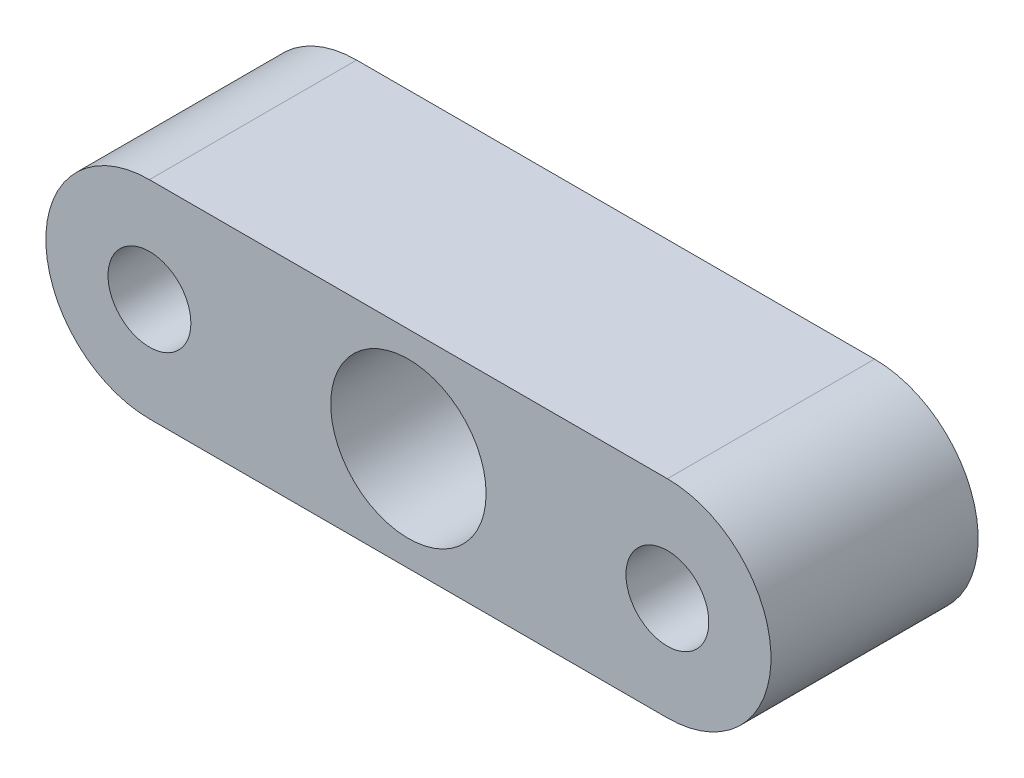
ISO-10303-21;
HEADER;
FILE_DESCRIPTION(('STEP AP214'),'2;1');
FILE_NAME('part.step','',(''),(''),'','','');
FILE_SCHEMA(('AUTOMOTIVE_DESIGN { 1 0 10303 214 1 1 1 1 }'));
ENDSEC;
DATA;
#1=APPLICATION_CONTEXT('core data for automotive mechanical design processes');
#2=APPLICATION_PROTOCOL_DEFINITION('international standard','automotive_design',2000,#1);
#3=PRODUCT_CONTEXT('',#1,'mechanical');
#4=PRODUCT('Part','Part','',(#3));
#5=PRODUCT_RELATED_PRODUCT_CATEGORY('part','',(#4));
#6=PRODUCT_DEFINITION_FORMATION('','',#4);
#7=PRODUCT_DEFINITION_CONTEXT('part definition',#1,'design');
#8=PRODUCT_DEFINITION('design','',#6,#7);
#9=PRODUCT_DEFINITION_SHAPE('','',#8);
#10=(LENGTH_UNIT() NAMED_UNIT(*) SI_UNIT(.MILLI.,.METRE.));
#11=(NAMED_UNIT(*) PLANE_ANGLE_UNIT() SI_UNIT($,.RADIAN.));
#12=(NAMED_UNIT(*) SI_UNIT($,.STERADIAN.) SOLID_ANGLE_UNIT());
#13=UNCERTAINTY_MEASURE_WITH_UNIT(LENGTH_MEASURE(1.E-05),#10,'distance_accuracy_value','');
#14=(GEOMETRIC_REPRESENTATION_CONTEXT(3) GLOBAL_UNCERTAINTY_ASSIGNED_CONTEXT((#13)) GLOBAL_UNIT_ASSIGNED_CONTEXT((#10,
#11,#12)) REPRESENTATION_CONTEXT('',''));
#15=CARTESIAN_POINT('',(0.,0.,0.));
#16=DIRECTION('',(0.,0.,1.));
#17=DIRECTION('',(1.,0.,0.));
#18=AXIS2_PLACEMENT_3D('',#15,#16,#17);
#19=CARTESIAN_POINT('',(-25.,0.,20.));
#20=DIRECTION('',(0.,0.,1.));
#21=DIRECTION('',(1.,0.,0.));
#22=AXIS2_PLACEMENT_3D('',#19,#20,#21);
#23=PLANE('',#22);
#24=CARTESIAN_POINT('',(-25.,0.,20.));
#25=DIRECTION('',(0.,0.,1.));
#26=DIRECTION('',(1.,0.,0.));
#27=AXIS2_PLACEMENT_3D('',#24,#25,#26);
#28=CIRCLE('',#27,4.);
#29=CARTESIAN_POINT('',(-21.,0.,20.));
#30=VERTEX_POINT('',#29);
#31=EDGE_CURVE('E117',#30,#30,#28,.T.);
#32=ORIENTED_EDGE('',*,*,#31,.F.);
#33=EDGE_LOOP('',(#32));
#34=FACE_BOUND('',#33,.T.);
#35=CARTESIAN_POINT('',(-25.,0.,20.));
#36=DIRECTION('',(0.,0.,1.));
#37=DIRECTION('',(1.,0.,0.));
#38=AXIS2_PLACEMENT_3D('',#35,#36,#37);
#39=CIRCLE('',#38,10.);
#40=CARTESIAN_POINT('',(-25.,10.,20.));
#41=VERTEX_POINT('',#40);
#42=CARTESIAN_POINT('',(-25.,-10.,20.));
#43=VERTEX_POINT('',#42);
#44=EDGE_CURVE('E87',#41,#43,#39,.T.);
#45=ORIENTED_EDGE('',*,*,#44,.T.);
#46=DIRECTION('',(1.,0.,0.));
#47=VECTOR('',#46,1.);
#48=CARTESIAN_POINT('',(-25.,-10.,20.));
#49=LINE('',#48,#47);
#50=CARTESIAN_POINT('',(25.,-9.99999999999999,20.));
#51=VERTEX_POINT('',#50);
#52=EDGE_CURVE('E82',#43,#51,#49,.T.);
#53=ORIENTED_EDGE('',*,*,#52,.T.);
#54=CARTESIAN_POINT('',(25.,0.,20.));
#55=DIRECTION('',(0.,0.,1.));
#56=DIRECTION('',(1.,0.,0.));
#57=AXIS2_PLACEMENT_3D('',#54,#55,#56);
#58=CIRCLE('',#57,10.);
#59=CARTESIAN_POINT('',(25.,10.,20.));
#60=VERTEX_POINT('',#59);
#61=EDGE_CURVE('E85',#51,#60,#58,.T.);
#62=ORIENTED_EDGE('',*,*,#61,.T.);
#63=DIRECTION('',(-1.,0.,0.));
#64=VECTOR('',#63,1.);
#65=CARTESIAN_POINT('',(-25.,10.,20.));
#66=LINE('',#65,#64);
#67=EDGE_CURVE('E52',#60,#41,#66,.T.);
#68=ORIENTED_EDGE('',*,*,#67,.T.);
#69=EDGE_LOOP('',(#45,#53,#62,#68));
#70=FACE_BOUND('',#69,.T.);
#71=CARTESIAN_POINT('',(0.,0.,20.));
#72=DIRECTION('',(0.,0.,1.));
#73=DIRECTION('',(1.,0.,0.));
#74=AXIS2_PLACEMENT_3D('',#71,#72,#73);
#75=CIRCLE('',#74,7.5);
#76=CARTESIAN_POINT('',(7.5,0.,20.));
#77=VERTEX_POINT('',#76);
#78=EDGE_CURVE('E102',#77,#77,#75,.T.);
#79=ORIENTED_EDGE('',*,*,#78,.F.);
#80=EDGE_LOOP('',(#79));
#81=FACE_BOUND('',#80,.T.);
#82=CARTESIAN_POINT('',(25.,0.,20.));
#83=DIRECTION('',(0.,0.,1.));
#84=DIRECTION('',(-1.,0.,0.));
#85=AXIS2_PLACEMENT_3D('',#82,#83,#84);
#86=CIRCLE('',#85,4.);
#87=CARTESIAN_POINT('',(21.,0.,20.));
#88=VERTEX_POINT('',#87);
#89=EDGE_CURVE('E123',#88,#88,#86,.T.);
#90=ORIENTED_EDGE('',*,*,#89,.F.);
#91=EDGE_LOOP('',(#90));
#92=FACE_BOUND('',#91,.T.);
#93=ADVANCED_FACE('F35',(#34,#70,#81,#92),#23,.T.);
#94=CARTESIAN_POINT('',(-25.,0.,0.));
#95=DIRECTION('',(0.,0.,1.));
#96=DIRECTION('',(1.,0.,0.));
#97=AXIS2_PLACEMENT_3D('',#94,#95,#96);
#98=PLANE('',#97);
#99=CARTESIAN_POINT('',(-25.,0.,0.));
#100=DIRECTION('',(0.,0.,1.));
#101=DIRECTION('',(1.,0.,0.));
#102=AXIS2_PLACEMENT_3D('',#99,#100,#101);
#103=CIRCLE('',#102,10.);
#104=CARTESIAN_POINT('',(-25.,10.,0.));
#105=VERTEX_POINT('',#104);
#106=CARTESIAN_POINT('',(-25.,-10.,0.));
#107=VERTEX_POINT('',#106);
#108=EDGE_CURVE('E99',#105,#107,#103,.T.);
#109=ORIENTED_EDGE('',*,*,#108,.F.);
#110=DIRECTION('',(-1.,0.,0.));
#111=VECTOR('',#110,1.);
#112=CARTESIAN_POINT('',(-25.,10.,0.));
#113=LINE('',#112,#111);
#114=CARTESIAN_POINT('',(25.,10.,0.));
#115=VERTEX_POINT('',#114);
#116=EDGE_CURVE('E75',#115,#105,#113,.T.);
#117=ORIENTED_EDGE('',*,*,#116,.F.);
#118=CARTESIAN_POINT('',(25.,0.,0.));
#119=DIRECTION('',(0.,0.,1.));
#120=DIRECTION('',(1.,0.,0.));
#121=AXIS2_PLACEMENT_3D('',#118,#119,#120);
#122=CIRCLE('',#121,10.);
#123=CARTESIAN_POINT('',(25.,-9.99999999999999,0.));
#124=VERTEX_POINT('',#123);
#125=EDGE_CURVE('E69',#124,#115,#122,.T.);
#126=ORIENTED_EDGE('',*,*,#125,.F.);
#127=DIRECTION('',(1.,0.,0.));
#128=VECTOR('',#127,1.);
#129=CARTESIAN_POINT('',(-25.,-10.,0.));
#130=LINE('',#129,#128);
#131=EDGE_CURVE('E91',#107,#124,#130,.T.);
#132=ORIENTED_EDGE('',*,*,#131,.F.);
#133=EDGE_LOOP('',(#109,#117,#126,#132));
#134=FACE_BOUND('',#133,.T.);
#135=CARTESIAN_POINT('',(0.,0.,0.));
#136=DIRECTION('',(0.,0.,1.));
#137=DIRECTION('',(1.,0.,0.));
#138=AXIS2_PLACEMENT_3D('',#135,#136,#137);
#139=CIRCLE('',#138,7.5);
#140=CARTESIAN_POINT('',(7.5,0.,0.));
#141=VERTEX_POINT('',#140);
#142=EDGE_CURVE('E114',#141,#141,#139,.T.);
#143=ORIENTED_EDGE('',*,*,#142,.T.);
#144=EDGE_LOOP('',(#143));
#145=FACE_BOUND('',#144,.T.);
#146=CARTESIAN_POINT('',(-25.,0.,0.));
#147=DIRECTION('',(0.,0.,1.));
#148=DIRECTION('',(1.,0.,0.));
#149=AXIS2_PLACEMENT_3D('',#146,#147,#148);
#150=CIRCLE('',#149,4.);
#151=CARTESIAN_POINT('',(-21.,0.,0.));
#152=VERTEX_POINT('',#151);
#153=EDGE_CURVE('E120',#152,#152,#150,.T.);
#154=ORIENTED_EDGE('',*,*,#153,.T.);
#155=EDGE_LOOP('',(#154));
#156=FACE_BOUND('',#155,.T.);
#157=CARTESIAN_POINT('',(25.,0.,0.));
#158=DIRECTION('',(0.,0.,1.));
#159=DIRECTION('',(-1.,0.,0.));
#160=AXIS2_PLACEMENT_3D('',#157,#158,#159);
#161=CIRCLE('',#160,4.);
#162=CARTESIAN_POINT('',(21.,0.,0.));
#163=VERTEX_POINT('',#162);
#164=EDGE_CURVE('E126',#163,#163,#161,.T.);
#165=ORIENTED_EDGE('',*,*,#164,.T.);
#166=EDGE_LOOP('',(#165));
#167=FACE_BOUND('',#166,.T.);
#168=ADVANCED_FACE('F110',(#134,#145,#156,#167),#98,.F.);
#169=CARTESIAN_POINT('',(-25.,0.,20.));
#170=DIRECTION('',(0.,0.,-1.));
#171=DIRECTION('',(-1.,0.,0.));
#172=AXIS2_PLACEMENT_3D('',#169,#170,#171);
#173=CYLINDRICAL_SURFACE('',#172,10.);
#174=ORIENTED_EDGE('',*,*,#108,.T.);
#175=DIRECTION('',(0.,0.,-1.));
#176=VECTOR('',#175,1.);
#177=CARTESIAN_POINT('',(-25.,-10.,20.));
#178=LINE('',#177,#176);
#179=EDGE_CURVE('E11',#43,#107,#178,.T.);
#180=ORIENTED_EDGE('',*,*,#179,.F.);
#181=ORIENTED_EDGE('',*,*,#44,.F.);
#182=DIRECTION('',(0.,0.,-1.));
#183=VECTOR('',#182,1.);
#184=CARTESIAN_POINT('',(-25.,10.,20.));
#185=LINE('',#184,#183);
#186=EDGE_CURVE('E95',#41,#105,#185,.T.);
#187=ORIENTED_EDGE('',*,*,#186,.T.);
#188=EDGE_LOOP('',(#174,#180,#181,#187));
#189=FACE_BOUND('',#188,.T.);
#190=ADVANCED_FACE('F37',(#189),#173,.T.);
#191=CARTESIAN_POINT('',(-25.,-10.,20.));
#192=DIRECTION('',(0.,1.,0.));
#193=DIRECTION('',(0.,0.,1.));
#194=AXIS2_PLACEMENT_3D('',#191,#192,#193);
#195=PLANE('',#194);
#196=ORIENTED_EDGE('',*,*,#131,.T.);
#197=DIRECTION('',(0.,0.,-1.));
#198=VECTOR('',#197,1.);
#199=CARTESIAN_POINT('',(25.,-9.99999999999999,20.));
#200=LINE('',#199,#198);
#201=EDGE_CURVE('E44',#51,#124,#200,.T.);
#202=ORIENTED_EDGE('',*,*,#201,.F.);
#203=ORIENTED_EDGE('',*,*,#52,.F.);
#204=ORIENTED_EDGE('',*,*,#179,.T.);
#205=EDGE_LOOP('',(#196,#202,#203,#204));
#206=FACE_BOUND('',#205,.T.);
#207=ADVANCED_FACE('F90',(#206),#195,.F.);
#208=CARTESIAN_POINT('',(25.,0.,20.));
#209=DIRECTION('',(0.,0.,-1.));
#210=DIRECTION('',(-1.,0.,0.));
#211=AXIS2_PLACEMENT_3D('',#208,#209,#210);
#212=CYLINDRICAL_SURFACE('',#211,10.);
#213=ORIENTED_EDGE('',*,*,#125,.T.);
#214=DIRECTION('',(0.,0.,-1.));
#215=VECTOR('',#214,1.);
#216=CARTESIAN_POINT('',(25.,10.,20.));
#217=LINE('',#216,#215);
#218=EDGE_CURVE('E92',#60,#115,#217,.T.);
#219=ORIENTED_EDGE('',*,*,#218,.F.);
#220=ORIENTED_EDGE('',*,*,#61,.F.);
#221=ORIENTED_EDGE('',*,*,#201,.T.);
#222=EDGE_LOOP('',(#213,#219,#220,#221));
#223=FACE_BOUND('',#222,.T.);
#224=ADVANCED_FACE('F93',(#223),#212,.T.);
#225=CARTESIAN_POINT('',(-25.,10.,20.));
#226=DIRECTION('',(0.,-1.,0.));
#227=DIRECTION('',(0.,0.,-1.));
#228=AXIS2_PLACEMENT_3D('',#225,#226,#227);
#229=PLANE('',#228);
#230=ORIENTED_EDGE('',*,*,#116,.T.);
#231=ORIENTED_EDGE('',*,*,#186,.F.);
#232=ORIENTED_EDGE('',*,*,#67,.F.);
#233=ORIENTED_EDGE('',*,*,#218,.T.);
#234=EDGE_LOOP('',(#230,#231,#232,#233));
#235=FACE_BOUND('',#234,.T.);
#236=ADVANCED_FACE('F107',(#235),#229,.F.);
#237=CARTESIAN_POINT('',(0.,0.,20.));
#238=DIRECTION('',(0.,0.,-1.));
#239=DIRECTION('',(-1.,0.,0.));
#240=AXIS2_PLACEMENT_3D('',#237,#238,#239);
#241=CYLINDRICAL_SURFACE('',#240,7.5);
#242=ORIENTED_EDGE('',*,*,#78,.T.);
#243=EDGE_LOOP('',(#242));
#244=FACE_BOUND('',#243,.T.);
#245=ORIENTED_EDGE('',*,*,#142,.F.);
#246=EDGE_LOOP('',(#245));
#247=FACE_BOUND('',#246,.T.);
#248=ADVANCED_FACE('F144',(#244,#247),#241,.F.);
#249=CARTESIAN_POINT('',(-25.,0.,20.));
#250=DIRECTION('',(0.,0.,-1.));
#251=DIRECTION('',(-1.,0.,0.));
#252=AXIS2_PLACEMENT_3D('',#249,#250,#251);
#253=CYLINDRICAL_SURFACE('',#252,4.);
#254=ORIENTED_EDGE('',*,*,#31,.T.);
#255=EDGE_LOOP('',(#254));
#256=FACE_BOUND('',#255,.T.);
#257=ORIENTED_EDGE('',*,*,#153,.F.);
#258=EDGE_LOOP('',(#257));
#259=FACE_BOUND('',#258,.T.);
#260=ADVANCED_FACE('F190',(#256,#259),#253,.F.);
#261=CARTESIAN_POINT('',(25.,0.,20.));
#262=DIRECTION('',(0.,0.,-1.));
#263=DIRECTION('',(-1.,0.,0.));
#264=AXIS2_PLACEMENT_3D('',#261,#262,#263);
#265=CYLINDRICAL_SURFACE('',#264,4.);
#266=ORIENTED_EDGE('',*,*,#89,.T.);
#267=EDGE_LOOP('',(#266));
#268=FACE_BOUND('',#267,.T.);
#269=ORIENTED_EDGE('',*,*,#164,.F.);
#270=EDGE_LOOP('',(#269));
#271=FACE_BOUND('',#270,.T.);
#272=ADVANCED_FACE('F132',(#268,#271),#265,.F.);
#273=CLOSED_SHELL('',(#93,#168,#190,#207,#224,#236,#248,#260,#272));
#274=MANIFOLD_SOLID_BREP('B2',#273);
#275=ADVANCED_BREP_SHAPE_REPRESENTATION('',(#18,#274),#14);
#276=SHAPE_DEFINITION_REPRESENTATION(#9,#275);
ENDSEC;
END-ISO-10303-21;
